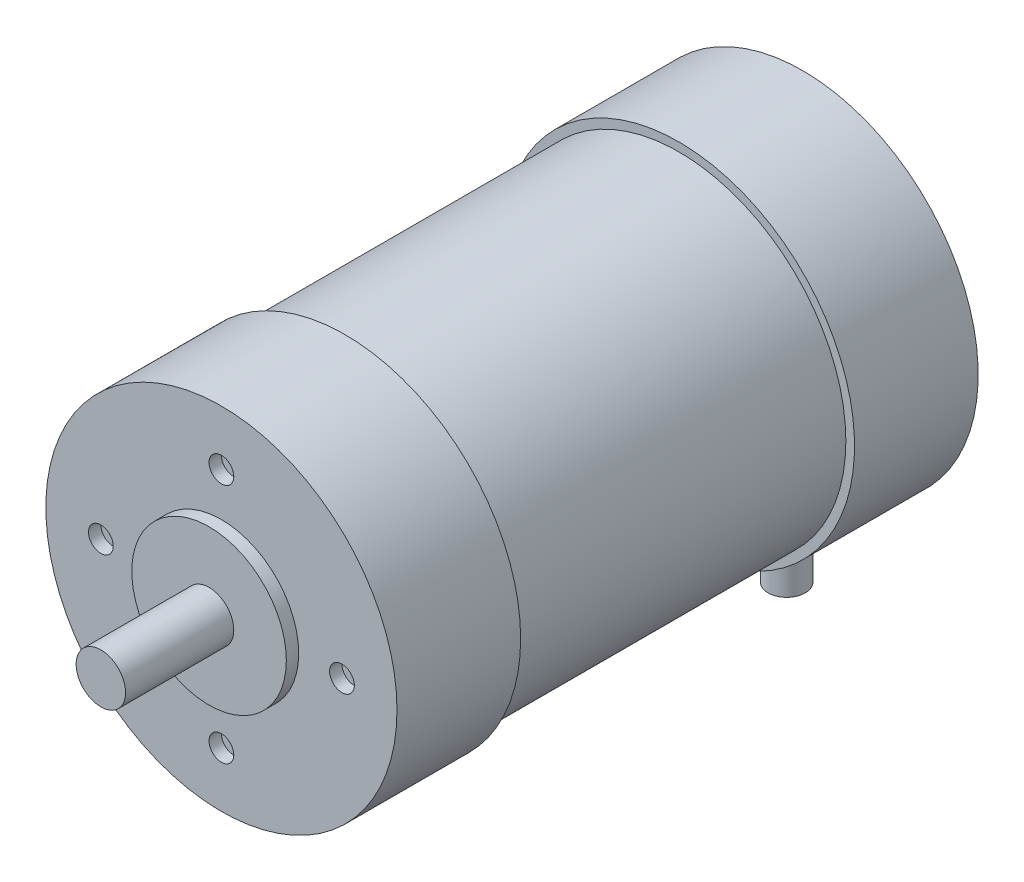
ISO-10303-21;
HEADER;
FILE_DESCRIPTION(('STEP AP214'),'2;1');
FILE_NAME('part.step','',(''),(''),'','','');
FILE_SCHEMA(('AUTOMOTIVE_DESIGN { 1 0 10303 214 1 1 1 1 }'));
ENDSEC;
DATA;
#1=APPLICATION_CONTEXT('core data for automotive mechanical design processes');
#2=APPLICATION_PROTOCOL_DEFINITION('international standard','automotive_design',2000,#1);
#3=PRODUCT_CONTEXT('',#1,'mechanical');
#4=PRODUCT('Part','Part','',(#3));
#5=PRODUCT_RELATED_PRODUCT_CATEGORY('part','',(#4));
#6=PRODUCT_DEFINITION_FORMATION('','',#4);
#7=PRODUCT_DEFINITION_CONTEXT('part definition',#1,'design');
#8=PRODUCT_DEFINITION('design','',#6,#7);
#9=PRODUCT_DEFINITION_SHAPE('','',#8);
#10=(LENGTH_UNIT() NAMED_UNIT(*) SI_UNIT(.MILLI.,.METRE.));
#11=(NAMED_UNIT(*) PLANE_ANGLE_UNIT() SI_UNIT($,.RADIAN.));
#12=(NAMED_UNIT(*) SI_UNIT($,.STERADIAN.) SOLID_ANGLE_UNIT());
#13=UNCERTAINTY_MEASURE_WITH_UNIT(LENGTH_MEASURE(1.E-05),#10,'distance_accuracy_value','');
#14=(GEOMETRIC_REPRESENTATION_CONTEXT(3) GLOBAL_UNCERTAINTY_ASSIGNED_CONTEXT((#13)) GLOBAL_UNIT_ASSIGNED_CONTEXT((#10,
#11,#12)) REPRESENTATION_CONTEXT('',''));
#15=CARTESIAN_POINT('',(0.,0.,0.));
#16=DIRECTION('',(0.,0.,1.));
#17=DIRECTION('',(1.,0.,0.));
#18=AXIS2_PLACEMENT_3D('',#15,#16,#17);
#19=CARTESIAN_POINT('',(0.,0.,0.));
#20=DIRECTION('',(0.,0.,1.));
#21=DIRECTION('',(1.,0.,0.));
#22=AXIS2_PLACEMENT_3D('',#19,#20,#21);
#23=PLANE('',#22);
#24=CARTESIAN_POINT('',(0.,-19.5,0.));
#25=DIRECTION('',(0.,0.,1.));
#26=DIRECTION('',(1.,0.,0.));
#27=AXIS2_PLACEMENT_3D('',#24,#25,#26);
#28=CIRCLE('',#27,2.);
#29=CARTESIAN_POINT('',(2.,-19.5,0.));
#30=VERTEX_POINT('',#29);
#31=EDGE_CURVE('E161',#30,#30,#28,.T.);
#32=ORIENTED_EDGE('',*,*,#31,.F.);
#33=EDGE_LOOP('',(#32));
#34=FACE_BOUND('',#33,.T.);
#35=CARTESIAN_POINT('',(-19.5,0.,0.));
#36=DIRECTION('',(0.,0.,1.));
#37=DIRECTION('',(1.,0.,0.));
#38=AXIS2_PLACEMENT_3D('',#35,#36,#37);
#39=CIRCLE('',#38,2.);
#40=CARTESIAN_POINT('',(-17.5,0.,0.));
#41=VERTEX_POINT('',#40);
#42=EDGE_CURVE('E155',#41,#41,#39,.T.);
#43=ORIENTED_EDGE('',*,*,#42,.F.);
#44=EDGE_LOOP('',(#43));
#45=FACE_BOUND('',#44,.T.);
#46=CARTESIAN_POINT('',(19.5,0.,0.));
#47=DIRECTION('',(0.,0.,1.));
#48=DIRECTION('',(1.,0.,0.));
#49=AXIS2_PLACEMENT_3D('',#46,#47,#48);
#50=CIRCLE('',#49,2.);
#51=CARTESIAN_POINT('',(21.5,0.,0.));
#52=VERTEX_POINT('',#51);
#53=EDGE_CURVE('E149',#52,#52,#50,.T.);
#54=ORIENTED_EDGE('',*,*,#53,.F.);
#55=EDGE_LOOP('',(#54));
#56=FACE_BOUND('',#55,.T.);
#57=CARTESIAN_POINT('',(0.,19.5,0.));
#58=DIRECTION('',(0.,0.,1.));
#59=DIRECTION('',(1.,0.,0.));
#60=AXIS2_PLACEMENT_3D('',#57,#58,#59);
#61=CIRCLE('',#60,2.);
#62=CARTESIAN_POINT('',(2.,19.5,0.));
#63=VERTEX_POINT('',#62);
#64=EDGE_CURVE('E143',#63,#63,#61,.T.);
#65=ORIENTED_EDGE('',*,*,#64,.F.);
#66=EDGE_LOOP('',(#65));
#67=FACE_BOUND('',#66,.T.);
#68=CARTESIAN_POINT('',(0.,0.,0.));
#69=DIRECTION('',(0.,0.,1.));
#70=DIRECTION('',(1.,0.,0.));
#71=AXIS2_PLACEMENT_3D('',#68,#69,#70);
#72=CIRCLE('',#71,28.4);
#73=CARTESIAN_POINT('',(28.4,0.,0.));
#74=VERTEX_POINT('',#73);
#75=EDGE_CURVE('E59',#74,#74,#72,.T.);
#76=ORIENTED_EDGE('',*,*,#75,.T.);
#77=EDGE_LOOP('',(#76));
#78=FACE_BOUND('',#77,.T.);
#79=CARTESIAN_POINT('',(0.,0.,0.));
#80=DIRECTION('',(0.,0.,1.));
#81=DIRECTION('',(1.,0.,0.));
#82=AXIS2_PLACEMENT_3D('',#79,#80,#81);
#83=CIRCLE('',#82,12.5);
#84=CARTESIAN_POINT('',(12.5,0.,0.));
#85=VERTEX_POINT('',#84);
#86=EDGE_CURVE('E134',#85,#85,#83,.T.);
#87=ORIENTED_EDGE('',*,*,#86,.F.);
#88=EDGE_LOOP('',(#87));
#89=FACE_BOUND('',#88,.T.);
#90=ADVANCED_FACE('F39',(#34,#45,#56,#67,#78,#89),#23,.T.);
#91=CARTESIAN_POINT('',(0.,0.,-94.));
#92=DIRECTION('',(0.,0.,1.));
#93=DIRECTION('',(1.,0.,0.));
#94=AXIS2_PLACEMENT_3D('',#91,#92,#93);
#95=CYLINDRICAL_SURFACE('',#94,27.);
#96=CARTESIAN_POINT('',(0.,0.,-20.));
#97=DIRECTION('',(0.,0.,1.));
#98=DIRECTION('',(1.,0.,0.));
#99=AXIS2_PLACEMENT_3D('',#96,#97,#98);
#100=CIRCLE('',#99,27.);
#101=CARTESIAN_POINT('',(27.,0.,-20.));
#102=VERTEX_POINT('',#101);
#103=EDGE_CURVE('E108',#102,#102,#100,.T.);
#104=ORIENTED_EDGE('',*,*,#103,.F.);
#105=EDGE_LOOP('',(#104));
#106=FACE_BOUND('',#105,.T.);
#107=CARTESIAN_POINT('',(0.,0.,-74.));
#108=DIRECTION('',(0.,0.,-1.));
#109=DIRECTION('',(-1.,0.,0.));
#110=AXIS2_PLACEMENT_3D('',#107,#108,#109);
#111=CIRCLE('',#110,27.);
#112=CARTESIAN_POINT('',(-27.,0.,-74.));
#113=VERTEX_POINT('',#112);
#114=EDGE_CURVE('E121',#113,#113,#111,.T.);
#115=ORIENTED_EDGE('',*,*,#114,.F.);
#116=EDGE_LOOP('',(#115));
#117=FACE_BOUND('',#116,.T.);
#118=ADVANCED_FACE('F41',(#106,#117),#95,.T.);
#119=CARTESIAN_POINT('',(0.,0.,-20.));
#120=DIRECTION('',(0.,0.,1.));
#121=DIRECTION('',(1.,0.,0.));
#122=AXIS2_PLACEMENT_3D('',#119,#120,#121);
#123=CYLINDRICAL_SURFACE('',#122,28.4);
#124=CARTESIAN_POINT('',(0.,0.,-20.));
#125=DIRECTION('',(0.,0.,1.));
#126=DIRECTION('',(1.,0.,0.));
#127=AXIS2_PLACEMENT_3D('',#124,#125,#126);
#128=CIRCLE('',#127,28.4);
#129=CARTESIAN_POINT('',(28.4,0.,-20.));
#130=VERTEX_POINT('',#129);
#131=EDGE_CURVE('E55',#130,#130,#128,.T.);
#132=ORIENTED_EDGE('',*,*,#131,.T.);
#133=EDGE_LOOP('',(#132));
#134=FACE_BOUND('',#133,.T.);
#135=ORIENTED_EDGE('',*,*,#75,.F.);
#136=EDGE_LOOP('',(#135));
#137=FACE_BOUND('',#136,.T.);
#138=ADVANCED_FACE('F94',(#134,#137),#123,.T.);
#139=CARTESIAN_POINT('',(0.,0.,-20.));
#140=DIRECTION('',(0.,0.,1.));
#141=DIRECTION('',(1.,0.,0.));
#142=AXIS2_PLACEMENT_3D('',#139,#140,#141);
#143=PLANE('',#142);
#144=ORIENTED_EDGE('',*,*,#103,.T.);
#145=EDGE_LOOP('',(#144));
#146=FACE_BOUND('',#145,.T.);
#147=ORIENTED_EDGE('',*,*,#131,.F.);
#148=EDGE_LOOP('',(#147));
#149=FACE_BOUND('',#148,.T.);
#150=ADVANCED_FACE('F85',(#146,#149),#143,.F.);
#151=CARTESIAN_POINT('',(0.,0.,-74.));
#152=DIRECTION('',(0.,0.,-1.));
#153=DIRECTION('',(-1.,0.,0.));
#154=AXIS2_PLACEMENT_3D('',#151,#152,#153);
#155=CYLINDRICAL_SURFACE('',#154,28.4);
#156=CARTESIAN_POINT('',(7.,-27.5238078760916,-81.4314864277551));
#157=CARTESIAN_POINT('',(6.8309176236314,-27.5668078110942,-81.4314925981187));
#158=CARTESIAN_POINT('',(6.66134154886599,-27.6082618431189,-81.4458194305876));
#159=CARTESIAN_POINT('',(6.32601267751149,-27.6870239441381,-81.5032250705098));
#160=CARTESIAN_POINT('',(6.16026303629806,-27.7243286819469,-81.5463267877426));
#161=CARTESIAN_POINT('',(5.83746348517817,-27.7940877070157,-81.6605961285709));
#162=CARTESIAN_POINT('',(5.68042052847133,-27.826538151756,-81.7317858253711));
#163=CARTESIAN_POINT('',(5.38013287970048,-27.8861548211975,-81.9005413972071));
#164=CARTESIAN_POINT('',(5.23688485707698,-27.9133223230008,-81.998100883929));
#165=CARTESIAN_POINT('',(4.97150419152741,-27.9617955644842,-82.2147430981071));
#166=CARTESIAN_POINT('',(4.84900271029016,-27.9832088621463,-82.3333499869032));
#167=CARTESIAN_POINT('',(4.62553448717353,-28.0210154868692,-82.5900560873981));
#168=CARTESIAN_POINT('',(4.52456643779123,-28.037409118749,-82.7281541147547));
#169=CARTESIAN_POINT('',(4.34885360966717,-28.0651970397568,-83.0174182520992));
#170=CARTESIAN_POINT('',(4.27370195256536,-28.076669682665,-83.1683298445736));
#171=CARTESIAN_POINT('',(4.14964710992014,-28.0952734082415,-83.4808308415308));
#172=CARTESIAN_POINT('',(4.10074279883632,-28.1024046770786,-83.6424197878127));
#173=CARTESIAN_POINT('',(4.03090748026973,-28.1125067221829,-83.970563989551));
#174=CARTESIAN_POINT('',(4.00979812910643,-28.1155040295703,-84.1370805025952));
#175=CARTESIAN_POINT('',(3.99560459901099,-28.1175247631607,-84.4713269428981));
#176=CARTESIAN_POINT('',(4.0025200115661,-28.1165482472895,-84.6390568524338));
#177=CARTESIAN_POINT('',(4.04413446518686,-28.1105924568381,-84.9706938462967));
#178=CARTESIAN_POINT('',(4.07879020016157,-28.1056194212737,-85.1346064797303));
#179=CARTESIAN_POINT('',(4.17478573872236,-28.0915200456278,-85.4542315239989));
#180=CARTESIAN_POINT('',(4.23612532350686,-28.0823937396022,-85.6099440020617));
#181=CARTESIAN_POINT('',(4.3836844421151,-28.0597373169236,-85.9088814575431));
#182=CARTESIAN_POINT('',(4.46992128679869,-28.046204135366,-86.0520976558681));
#183=CARTESIAN_POINT('',(4.66463550851809,-28.0144761333193,-86.3219238210659));
#184=CARTESIAN_POINT('',(4.77311285179797,-27.9962813199054,-86.4485338131425));
#185=CARTESIAN_POINT('',(5.00951835681816,-27.9549485735576,-86.6822020350893));
#186=CARTESIAN_POINT('',(5.13752660565853,-27.9317901211002,-86.7891755724932));
#187=CARTESIAN_POINT('',(5.40878568227077,-27.8805319694691,-86.9801239321495));
#188=CARTESIAN_POINT('',(5.55203710894841,-27.8524320761175,-87.0640978502813));
#189=CARTESIAN_POINT('',(5.85138442460587,-27.79109387322,-87.2079215330396));
#190=CARTESIAN_POINT('',(6.00761606922231,-27.7577968788405,-87.2674634344442));
#191=CARTESIAN_POINT('',(6.32684102575759,-27.6867805672414,-87.3597064019346));
#192=CARTESIAN_POINT('',(6.48983509578806,-27.6490607533246,-87.3924044500627));
#193=CARTESIAN_POINT('',(6.82198550580776,-27.5690109939854,-87.4309731203821));
#194=CARTESIAN_POINT('',(6.99119637371139,-27.5265930372759,-87.4361901894975));
#195=CARTESIAN_POINT('',(7.32739869272656,-27.4390128934422,-87.4183181277016));
#196=CARTESIAN_POINT('',(7.49438975761139,-27.3938502361871,-87.395224134419));
#197=CARTESIAN_POINT('',(7.82654466242949,-27.3008386497004,-87.3205391186306));
#198=CARTESIAN_POINT('',(7.99151740223535,-27.2529498157957,-87.2681466151414));
#199=CARTESIAN_POINT('',(8.31013553053945,-27.1574913850453,-87.1358003225909));
#200=CARTESIAN_POINT('',(8.46377917700904,-27.109921838313,-87.0558423055761));
#201=CARTESIAN_POINT('',(8.75753270985191,-27.0164711845738,-86.8690625008566));
#202=CARTESIAN_POINT('',(8.89743142902409,-26.970621618386,-86.7618919822588));
#203=CARTESIAN_POINT('',(9.15709709520029,-26.8835704168417,-86.5238400174977));
#204=CARTESIAN_POINT('',(9.27686561875858,-26.8423684175807,-86.3929604298481));
#205=CARTESIAN_POINT('',(9.48964324282202,-26.7678745476277,-86.114242347929));
#206=CARTESIAN_POINT('',(9.58322849665856,-26.7344157436038,-85.966889482332));
#207=CARTESIAN_POINT('',(9.74391099863547,-26.6762730645419,-85.6568051674973));
#208=CARTESIAN_POINT('',(9.81101934879267,-26.6515855120678,-85.4940801994792));
#209=CARTESIAN_POINT('',(9.91296787056867,-26.6138285584465,-85.1678003697596));
#210=CARTESIAN_POINT('',(9.94942416559528,-26.6001789663317,-85.0048174779155));
#211=CARTESIAN_POINT('',(9.99477458450298,-26.583173094088,-84.6745506464649));
#212=CARTESIAN_POINT('',(10.0036777915361,-26.5798134217876,-84.5072681426091));
#213=CARTESIAN_POINT('',(9.99379751596848,-26.5835290560295,-84.1814952147206));
#214=CARTESIAN_POINT('',(9.97628661472081,-26.5901247417619,-84.0229587787125));
#215=CARTESIAN_POINT('',(9.91658798637421,-26.6124460625017,-83.7112851740506));
#216=CARTESIAN_POINT('',(9.87440057622977,-26.6281715802419,-83.5581479360744));
#217=CARTESIAN_POINT('',(9.76677541357202,-26.6678339513716,-83.2610212020541));
#218=CARTESIAN_POINT('',(9.70128213118657,-26.6917904115213,-83.1170545306765));
#219=CARTESIAN_POINT('',(9.54925315149194,-26.7465562259906,-82.8421484906771));
#220=CARTESIAN_POINT('',(9.46271403190105,-26.7773666947768,-82.7112112456662));
#221=CARTESIAN_POINT('',(9.26662810400794,-26.8458723278537,-82.4594213541537));
#222=CARTESIAN_POINT('',(9.1561907640512,-26.8838231023947,-82.3393324289642));
#223=CARTESIAN_POINT('',(8.91814158751954,-26.9637256814701,-82.1191182157343));
#224=CARTESIAN_POINT('',(8.79052143836999,-27.0056794196493,-82.0190026488022));
#225=CARTESIAN_POINT('',(8.5138401418346,-27.0942201204714,-81.8358491740536));
#226=CARTESIAN_POINT('',(8.36397842239105,-27.1409349759011,-81.7540819455496));
#227=CARTESIAN_POINT('',(8.05282307196101,-27.234874248604,-81.6171634417797));
#228=CARTESIAN_POINT('',(7.8915388655095,-27.2820982191545,-81.5619905107128));
#229=CARTESIAN_POINT('',(7.60821536160174,-27.3622052085293,-81.4912482639338));
#230=CARTESIAN_POINT('',(7.48790710486876,-27.3953835563043,-81.4689028959094));
#231=CARTESIAN_POINT('',(7.24515257649744,-27.4605819572635,-81.4390197076212));
#232=CARTESIAN_POINT('',(7.1227062958447,-27.4926020055623,-81.4314819498049));
#233=CARTESIAN_POINT('',(7.,-27.5238078760916,-81.4314864277551));
#234=B_SPLINE_CURVE_WITH_KNOTS('',3,(#156,#157,#158,#159,#160,#161,#162,#163,#164,#165,#166,
#167,#168,#169,#170,#171,#172,#173,#174,#175,#176,#177,#178,#179,#180,#181,#182,#183,#184,#185,
#186,#187,#188,#189,#190,#191,#192,#193,#194,#195,#196,#197,#198,#199,#200,#201,#202,#203,#204,
#205,#206,#207,#208,#209,#210,#211,#212,#213,#214,#215,#216,#217,#218,#219,#220,#221,#222,#223,
#224,#225,#226,#227,#228,#229,#230,#231,#232,#233),.UNSPECIFIED.,.T.,.F.,(4,2,2,2,2,2,2,2,2,2,2,
2,2,2,2,2,2,2,2,2,2,2,2,2,2,2,2,2,2,2,2,2,2,2,2,2,2,2,4),(0.,0.52295081158189,1.04631847969134,
1.57009826307432,2.09375126974448,2.60680055899042,3.11981868717665,3.62433428746094,
4.12882825134535,4.6300691440705,5.1313027303093,5.63175535114956,6.13220386846783,
6.63300118497431,7.13379774139205,7.63670594239192,8.13963390999917,8.64871776995098,
9.1578588565309,9.67905540728369,10.2003414850967,10.7366390980404,11.2730190040617,
11.8166539860796,12.3602463718982,12.8907170926075,13.420965144913,13.9210994429459,
14.4210688491158,14.8977077451247,15.3743405191366,15.8521166337961,16.3299704920502,
16.8302942526789,17.3308609318602,17.8594658557884,18.3876396052017,18.7671533532309,
19.1466687017632),.UNSPECIFIED.);
#235=CARTESIAN_POINT('',(7.,-27.5238078760916,-81.4314864277551));
#236=VERTEX_POINT('',#235);
#237=EDGE_CURVE('E10',#236,#236,#234,.T.);
#238=ORIENTED_EDGE('',*,*,#237,.F.);
#239=EDGE_LOOP('',(#238));
#240=FACE_BOUND('',#239,.T.);
#241=CARTESIAN_POINT('',(-7.,-27.5238078760916,-81.4314864277551));
#242=CARTESIAN_POINT('',(-7.17497004166131,-27.47930594361,-81.4314938160888));
#243=CARTESIAN_POINT('',(-7.34964395868325,-27.4330889116566,-81.4468397552596));
#244=CARTESIAN_POINT('',(-7.69334322337776,-27.338697045564,-81.5074802994634));
#245=CARTESIAN_POINT('',(-7.86236014337892,-27.2905195083477,-81.5528176657875));
#246=CARTESIAN_POINT('',(-8.18983317558535,-27.1940387597737,-81.6720258350343));
#247=CARTESIAN_POINT('',(-8.34829743875431,-27.1457356760723,-81.7458743088361));
#248=CARTESIAN_POINT('',(-8.6504048551798,-27.0509812015139,-81.9201971090237));
#249=CARTESIAN_POINT('',(-8.79405170875643,-27.0045293501394,-82.0206647653841));
#250=CARTESIAN_POINT('',(-9.0624195732316,-26.9156564188223,-82.245827996543));
#251=CARTESIAN_POINT('',(-9.18713931762193,-26.8732356086879,-82.37052519139));
#252=CARTESIAN_POINT('',(-9.41359490461798,-26.7947500662591,-82.6410525112974));
#253=CARTESIAN_POINT('',(-9.51533464351279,-26.7586842566946,-82.7868790469583));
#254=CARTESIAN_POINT('',(-9.68858213912015,-26.6964332789671,-83.0895742542312));
#255=CARTESIAN_POINT('',(-9.76112237822759,-26.6699150291024,-83.2457822214787));
#256=CARTESIAN_POINT('',(-9.87864383969205,-26.6266100263304,-83.5694999743247));
#257=CARTESIAN_POINT('',(-9.92363745800604,-26.6098188964104,-83.7370046386902));
#258=CARTESIAN_POINT('',(-9.98233792798421,-26.5878516117253,-84.0678766942694));
#259=CARTESIAN_POINT('',(-9.99773667184892,-26.5820476607293,-84.2309035372935));
#260=CARTESIAN_POINT('',(-10.0017976945924,-26.5805202351137,-84.5573204578859));
#261=CARTESIAN_POINT('',(-9.99046563703069,-26.5847946251565,-84.7207104511841));
#262=CARTESIAN_POINT('',(-9.94230696511288,-26.6028409557983,-85.0379373238558));
#263=CARTESIAN_POINT('',(-9.90627708993116,-26.6163160349627,-85.1919134259339));
#264=CARTESIAN_POINT('',(-9.8109087910136,-26.6516159784208,-85.4914400501774));
#265=CARTESIAN_POINT('',(-9.75156851297081,-26.6734415069764,-85.6369899009903));
#266=CARTESIAN_POINT('',(-9.61003851144285,-26.7247623479693,-85.9191562011338));
#267=CARTESIAN_POINT('',(-9.52737376510511,-26.7544161820919,-86.0555048688941));
#268=CARTESIAN_POINT('',(-9.34237301906553,-26.8195761677617,-86.3125451992126));
#269=CARTESIAN_POINT('',(-9.24003220141929,-26.8550837523725,-86.4332330148573));
#270=CARTESIAN_POINT('',(-9.01236010556556,-26.9323702977787,-86.6626152798402));
#271=CARTESIAN_POINT('',(-8.88607118354313,-26.9743873273323,-86.7702790731388));
#272=CARTESIAN_POINT('',(-8.61815324960057,-27.0611762118056,-86.9630542547518));
#273=CARTESIAN_POINT('',(-8.4765201630819,-27.1059487970851,-87.0481596319634));
#274=CARTESIAN_POINT('',(-8.17430867000343,-27.1986546095214,-87.1974862601061));
#275=CARTESIAN_POINT('',(-8.01314479929409,-27.2466358629934,-87.2604957129632));
#276=CARTESIAN_POINT('',(-7.68216816446623,-27.3417983604668,-87.3579887580677));
#277=CARTESIAN_POINT('',(-7.51235446240305,-27.3889795169672,-87.3924692497565));
#278=CARTESIAN_POINT('',(-7.16640757741786,-27.4815403439945,-87.431987228374));
#279=CARTESIAN_POINT('',(-6.99022074841059,-27.5268883140486,-87.4366330523028));
#280=CARTESIAN_POINT('',(-6.63881102993907,-27.6137454580274,-87.4148607041723));
#281=CARTESIAN_POINT('',(-6.46358804491298,-27.6552550192129,-87.3884456695696));
#282=CARTESIAN_POINT('',(-6.1229349503463,-27.7326448349457,-87.3056587391637));
#283=CARTESIAN_POINT('',(-5.95737932137803,-27.7686207186224,-87.2498937896053));
#284=CARTESIAN_POINT('',(-5.63758798564498,-27.8353065991168,-87.109970710359));
#285=CARTESIAN_POINT('',(-5.4833503956564,-27.8660174731282,-87.025817317365));
#286=CARTESIAN_POINT('',(-5.1955306692622,-27.9210913895255,-86.8341741445084));
#287=CARTESIAN_POINT('',(-5.06147625431005,-27.9456138569051,-86.7274391138382));
#288=CARTESIAN_POINT('',(-4.81306141242432,-27.9894691044483,-86.4922022554667));
#289=CARTESIAN_POINT('',(-4.69869873310299,-28.0088024782944,-86.3637029205584));
#290=CARTESIAN_POINT('',(-4.4954289037343,-28.042138814776,-86.0914284182525));
#291=CARTESIAN_POINT('',(-4.40605419785626,-28.0562415670084,-85.948014273897));
#292=CARTESIAN_POINT('',(-4.25251627931989,-28.0799246480935,-85.6479296120485));
#293=CARTESIAN_POINT('',(-4.18835171811268,-28.0895052188536,-85.4912598041765));
#294=CARTESIAN_POINT('',(-4.08766385705169,-28.1043339992544,-85.1706028301424));
#295=CARTESIAN_POINT('',(-4.0509027914568,-28.1096195119001,-85.0066919960929));
#296=CARTESIAN_POINT('',(-4.00521225501553,-28.116166479952,-84.6749576328061));
#297=CARTESIAN_POINT('',(-3.99628231360948,-28.1174280033945,-84.5071341697706));
#298=CARTESIAN_POINT('',(-4.00651068136101,-28.1159722521064,-84.172785934704));
#299=CARTESIAN_POINT('',(-4.02559866738789,-28.1132649389129,-84.0062589622529));
#300=CARTESIAN_POINT('',(-4.09115952100544,-28.1037986321125,-83.678806517368));
#301=CARTESIAN_POINT('',(-4.13763220558546,-28.0970396655826,-83.5178810075076));
#302=CARTESIAN_POINT('',(-4.25656619453294,-28.0792670233942,-83.2061695906257));
#303=CARTESIAN_POINT('',(-4.32903056777194,-28.0682528453056,-83.0553848834391));
#304=CARTESIAN_POINT('',(-4.49774525780997,-28.0417108739752,-82.7682209917161));
#305=CARTESIAN_POINT('',(-4.59399455645986,-28.0261832739322,-82.6318411909128));
#306=CARTESIAN_POINT('',(-4.8076551812933,-27.9903230622741,-82.3768904833594));
#307=CARTESIAN_POINT('',(-4.92512459521207,-27.9699772124669,-82.2583701403691));
#308=CARTESIAN_POINT('',(-5.17751108176518,-27.9243583893367,-82.0427443947944));
#309=CARTESIAN_POINT('',(-5.31243253303757,-27.8990841786997,-81.9456443830721));
#310=CARTESIAN_POINT('',(-5.59705800311291,-27.8433863260617,-81.7744932488464));
#311=CARTESIAN_POINT('',(-5.74689489815595,-27.8129142768208,-81.7006793169084));
#312=CARTESIAN_POINT('',(-6.0557026312005,-27.7473115302834,-81.5791562081822));
#313=CARTESIAN_POINT('',(-6.21466418324322,-27.7121855231972,-81.5314209944573));
#314=CARTESIAN_POINT('',(-6.47876353061158,-27.6513440710147,-81.4752390054127));
#315=CARTESIAN_POINT('',(-6.5825556118209,-27.6268247820528,-81.4588253092943));
#316=CARTESIAN_POINT('',(-6.79093366032467,-27.5763434665917,-81.4369468366714));
#317=CARTESIAN_POINT('',(-6.89551962441044,-27.5503814459209,-81.4314820159377));
#318=CARTESIAN_POINT('',(-7.,-27.5238078760916,-81.4314864277551));
#319=B_SPLINE_CURVE_WITH_KNOTS('',3,(#241,#242,#243,#244,#245,#246,#247,#248,#249,#250,#251,
#252,#253,#254,#255,#256,#257,#258,#259,#260,#261,#262,#263,#264,#265,#266,#267,#268,#269,#270,
#271,#272,#273,#274,#275,#276,#277,#278,#279,#280,#281,#282,#283,#284,#285,#286,#287,#288,#289,
#290,#291,#292,#293,#294,#295,#296,#297,#298,#299,#300,#301,#302,#303,#304,#305,#306,#307,#308,
#309,#310,#311,#312,#313,#314,#315,#316,#317,#318),.UNSPECIFIED.,.T.,.F.,(4,2,2,2,2,2,2,2,2,2,2,
2,2,2,2,2,2,2,2,2,2,2,2,2,2,2,2,2,2,2,2,2,2,2,2,2,2,2,4),(0.,0.541223563993474,1.08322046378803,
1.62479374467412,2.16623145051405,2.70770537071832,3.24908741430139,3.76915657374306,
4.28899153013934,4.77810427160992,5.26711339215626,5.74104690304556,6.2150181222587,
6.69944143696013,7.18398352049058,7.69528919731131,8.2067309842302,8.74295538384889,
9.27923805326953,9.82254677566697,10.3658006231754,10.8982376908382,11.4305859637431,
11.9473600094787,12.4640749060416,12.9703516982534,13.4766014048617,13.9784058226247,
14.4802017559946,14.9807403667038,15.4812756323749,15.9818700163427,16.4824429753334,
16.984407555101,17.4864983207084,17.9935495255042,18.5000935619789,18.8232772861028,
19.1464597046875),.UNSPECIFIED.);
#320=CARTESIAN_POINT('',(-7.,-27.5238078760916,-81.4314864277551));
#321=VERTEX_POINT('',#320);
#322=EDGE_CURVE('E51',#321,#321,#319,.T.);
#323=ORIENTED_EDGE('',*,*,#322,.F.);
#324=EDGE_LOOP('',(#323));
#325=FACE_BOUND('',#324,.T.);
#326=CARTESIAN_POINT('',(0.,0.,-74.));
#327=DIRECTION('',(0.,0.,-1.));
#328=DIRECTION('',(-1.,0.,0.));
#329=AXIS2_PLACEMENT_3D('',#326,#327,#328);
#330=CIRCLE('',#329,28.4);
#331=CARTESIAN_POINT('',(-28.4,0.,-74.));
#332=VERTEX_POINT('',#331);
#333=EDGE_CURVE('E114',#332,#332,#330,.T.);
#334=ORIENTED_EDGE('',*,*,#333,.T.);
#335=EDGE_LOOP('',(#334));
#336=FACE_BOUND('',#335,.T.);
#337=CARTESIAN_POINT('',(0.,0.,-94.));
#338=DIRECTION('',(0.,0.,-1.));
#339=DIRECTION('',(-1.,0.,0.));
#340=AXIS2_PLACEMENT_3D('',#337,#338,#339);
#341=CIRCLE('',#340,28.4);
#342=CARTESIAN_POINT('',(-28.4,0.,-94.));
#343=VERTEX_POINT('',#342);
#344=EDGE_CURVE('E117',#343,#343,#341,.T.);
#345=ORIENTED_EDGE('',*,*,#344,.F.);
#346=EDGE_LOOP('',(#345));
#347=FACE_BOUND('',#346,.T.);
#348=ADVANCED_FACE('F66',(#240,#325,#336,#347),#155,.T.);
#349=CARTESIAN_POINT('',(0.,0.,-74.));
#350=DIRECTION('',(0.,0.,-1.));
#351=DIRECTION('',(-1.,0.,0.));
#352=AXIS2_PLACEMENT_3D('',#349,#350,#351);
#353=PLANE('',#352);
#354=ORIENTED_EDGE('',*,*,#114,.T.);
#355=EDGE_LOOP('',(#354));
#356=FACE_BOUND('',#355,.T.);
#357=ORIENTED_EDGE('',*,*,#333,.F.);
#358=EDGE_LOOP('',(#357));
#359=FACE_BOUND('',#358,.T.);
#360=ADVANCED_FACE('F76',(#356,#359),#353,.F.);
#361=CARTESIAN_POINT('',(0.,0.,-94.));
#362=DIRECTION('',(0.,0.,1.));
#363=DIRECTION('',(1.,0.,0.));
#364=AXIS2_PLACEMENT_3D('',#361,#362,#363);
#365=PLANE('',#364);
#366=ORIENTED_EDGE('',*,*,#344,.T.);
#367=EDGE_LOOP('',(#366));
#368=FACE_BOUND('',#367,.T.);
#369=ADVANCED_FACE('F75',(#368),#365,.F.);
#370=CARTESIAN_POINT('',(-7.,-35.,-84.4314864277551));
#371=DIRECTION('',(0.,1.,0.));
#372=DIRECTION('',(0.,0.,1.));
#373=AXIS2_PLACEMENT_3D('',#370,#371,#372);
#374=CYLINDRICAL_SURFACE('',#373,3.);
#375=ORIENTED_EDGE('',*,*,#322,.T.);
#376=EDGE_LOOP('',(#375));
#377=FACE_BOUND('',#376,.T.);
#378=CARTESIAN_POINT('',(-7.,-35.,-84.4314864277551));
#379=DIRECTION('',(0.,1.,0.));
#380=DIRECTION('',(0.,0.,1.));
#381=AXIS2_PLACEMENT_3D('',#378,#379,#380);
#382=CIRCLE('',#381,3.);
#383=CARTESIAN_POINT('',(-7.,-35.,-81.4314864277551));
#384=VERTEX_POINT('',#383);
#385=EDGE_CURVE('E124',#384,#384,#382,.T.);
#386=ORIENTED_EDGE('',*,*,#385,.T.);
#387=EDGE_LOOP('',(#386));
#388=FACE_BOUND('',#387,.T.);
#389=ADVANCED_FACE('F70',(#377,#388),#374,.T.);
#390=CARTESIAN_POINT('',(0.,-35.,0.));
#391=DIRECTION('',(0.,1.,0.));
#392=DIRECTION('',(0.,0.,1.));
#393=AXIS2_PLACEMENT_3D('',#390,#391,#392);
#394=PLANE('',#393);
#395=ORIENTED_EDGE('',*,*,#385,.F.);
#396=EDGE_LOOP('',(#395));
#397=FACE_BOUND('',#396,.T.);
#398=ADVANCED_FACE('F74',(#397),#394,.F.);
#399=CARTESIAN_POINT('',(7.,-35.,-84.4314864277551));
#400=DIRECTION('',(0.,1.,0.));
#401=DIRECTION('',(0.,0.,1.));
#402=AXIS2_PLACEMENT_3D('',#399,#400,#401);
#403=CYLINDRICAL_SURFACE('',#402,3.);
#404=ORIENTED_EDGE('',*,*,#237,.T.);
#405=EDGE_LOOP('',(#404));
#406=FACE_BOUND('',#405,.T.);
#407=CARTESIAN_POINT('',(7.,-35.,-84.4314864277551));
#408=DIRECTION('',(0.,1.,0.));
#409=DIRECTION('',(0.,0.,1.));
#410=AXIS2_PLACEMENT_3D('',#407,#408,#409);
#411=CIRCLE('',#410,3.);
#412=CARTESIAN_POINT('',(7.,-35.,-81.4314864277551));
#413=VERTEX_POINT('',#412);
#414=EDGE_CURVE('E127',#413,#413,#411,.T.);
#415=ORIENTED_EDGE('',*,*,#414,.T.);
#416=EDGE_LOOP('',(#415));
#417=FACE_BOUND('',#416,.T.);
#418=ADVANCED_FACE('F220',(#406,#417),#403,.T.);
#419=CARTESIAN_POINT('',(0.,-35.,0.));
#420=DIRECTION('',(0.,1.,0.));
#421=DIRECTION('',(0.,0.,1.));
#422=AXIS2_PLACEMENT_3D('',#419,#420,#421);
#423=PLANE('',#422);
#424=ORIENTED_EDGE('',*,*,#414,.F.);
#425=EDGE_LOOP('',(#424));
#426=FACE_BOUND('',#425,.T.);
#427=ADVANCED_FACE('F207',(#426),#423,.F.);
#428=CARTESIAN_POINT('',(0.,0.,2.));
#429=DIRECTION('',(0.,0.,1.));
#430=DIRECTION('',(1.,0.,0.));
#431=AXIS2_PLACEMENT_3D('',#428,#429,#430);
#432=PLANE('',#431);
#433=CARTESIAN_POINT('',(0.,0.,2.));
#434=DIRECTION('',(0.,0.,1.));
#435=DIRECTION('',(1.,0.,0.));
#436=AXIS2_PLACEMENT_3D('',#433,#434,#435);
#437=CIRCLE('',#436,12.5);
#438=CARTESIAN_POINT('',(12.5,0.,2.));
#439=VERTEX_POINT('',#438);
#440=EDGE_CURVE('E133',#439,#439,#437,.T.);
#441=ORIENTED_EDGE('',*,*,#440,.T.);
#442=EDGE_LOOP('',(#441));
#443=FACE_BOUND('',#442,.T.);
#444=CARTESIAN_POINT('',(0.,0.,2.));
#445=DIRECTION('',(0.,0.,1.));
#446=DIRECTION('',(1.,0.,0.));
#447=AXIS2_PLACEMENT_3D('',#444,#445,#446);
#448=CIRCLE('',#447,4.);
#449=CARTESIAN_POINT('',(4.,0.,2.));
#450=VERTEX_POINT('',#449);
#451=EDGE_CURVE('E137',#450,#450,#448,.T.);
#452=ORIENTED_EDGE('',*,*,#451,.F.);
#453=EDGE_LOOP('',(#452));
#454=FACE_BOUND('',#453,.T.);
#455=ADVANCED_FACE('F203',(#443,#454),#432,.T.);
#456=CARTESIAN_POINT('',(0.,0.,2.));
#457=DIRECTION('',(0.,0.,-1.));
#458=DIRECTION('',(-1.,0.,0.));
#459=AXIS2_PLACEMENT_3D('',#456,#457,#458);
#460=CYLINDRICAL_SURFACE('',#459,12.5);
#461=ORIENTED_EDGE('',*,*,#440,.F.);
#462=EDGE_LOOP('',(#461));
#463=FACE_BOUND('',#462,.T.);
#464=ORIENTED_EDGE('',*,*,#86,.T.);
#465=EDGE_LOOP('',(#464));
#466=FACE_BOUND('',#465,.T.);
#467=ADVANCED_FACE('F206',(#463,#466),#460,.T.);
#468=CARTESIAN_POINT('',(0.,0.,19.5));
#469=DIRECTION('',(0.,0.,1.));
#470=DIRECTION('',(1.,0.,0.));
#471=AXIS2_PLACEMENT_3D('',#468,#469,#470);
#472=PLANE('',#471);
#473=CARTESIAN_POINT('',(0.,0.,19.5));
#474=DIRECTION('',(0.,0.,1.));
#475=DIRECTION('',(1.,0.,0.));
#476=AXIS2_PLACEMENT_3D('',#473,#474,#475);
#477=CIRCLE('',#476,4.);
#478=CARTESIAN_POINT('',(4.,0.,19.5));
#479=VERTEX_POINT('',#478);
#480=EDGE_CURVE('E130',#479,#479,#477,.T.);
#481=ORIENTED_EDGE('',*,*,#480,.T.);
#482=EDGE_LOOP('',(#481));
#483=FACE_BOUND('',#482,.T.);
#484=ADVANCED_FACE('F211',(#483),#472,.T.);
#485=CARTESIAN_POINT('',(0.,0.,19.5));
#486=DIRECTION('',(0.,0.,-1.));
#487=DIRECTION('',(-1.,0.,0.));
#488=AXIS2_PLACEMENT_3D('',#485,#486,#487);
#489=CYLINDRICAL_SURFACE('',#488,4.);
#490=ORIENTED_EDGE('',*,*,#451,.T.);
#491=EDGE_LOOP('',(#490));
#492=FACE_BOUND('',#491,.T.);
#493=ORIENTED_EDGE('',*,*,#480,.F.);
#494=EDGE_LOOP('',(#493));
#495=FACE_BOUND('',#494,.T.);
#496=ADVANCED_FACE('F201',(#492,#495),#489,.T.);
#497=CARTESIAN_POINT('',(0.,19.5,-2.));
#498=DIRECTION('',(0.,0.,1.));
#499=DIRECTION('',(1.,0.,0.));
#500=AXIS2_PLACEMENT_3D('',#497,#498,#499);
#501=CYLINDRICAL_SURFACE('',#500,2.);
#502=CARTESIAN_POINT('',(0.,19.5,-2.));
#503=DIRECTION('',(0.,0.,1.));
#504=DIRECTION('',(1.,0.,0.));
#505=AXIS2_PLACEMENT_3D('',#502,#503,#504);
#506=CIRCLE('',#505,2.);
#507=CARTESIAN_POINT('',(2.,19.5,-2.));
#508=VERTEX_POINT('',#507);
#509=EDGE_CURVE('E146',#508,#508,#506,.T.);
#510=ORIENTED_EDGE('',*,*,#509,.F.);
#511=EDGE_LOOP('',(#510));
#512=FACE_BOUND('',#511,.T.);
#513=ORIENTED_EDGE('',*,*,#64,.T.);
#514=EDGE_LOOP('',(#513));
#515=FACE_BOUND('',#514,.T.);
#516=ADVANCED_FACE('F197',(#512,#515),#501,.F.);
#517=CARTESIAN_POINT('',(0.,0.,-2.));
#518=DIRECTION('',(0.,0.,1.));
#519=DIRECTION('',(1.,0.,0.));
#520=AXIS2_PLACEMENT_3D('',#517,#518,#519);
#521=PLANE('',#520);
#522=ORIENTED_EDGE('',*,*,#509,.T.);
#523=EDGE_LOOP('',(#522));
#524=FACE_BOUND('',#523,.T.);
#525=ADVANCED_FACE('F193',(#524),#521,.T.);
#526=CARTESIAN_POINT('',(19.5,0.,-2.));
#527=DIRECTION('',(0.,0.,1.));
#528=DIRECTION('',(1.,0.,0.));
#529=AXIS2_PLACEMENT_3D('',#526,#527,#528);
#530=CYLINDRICAL_SURFACE('',#529,2.);
#531=CARTESIAN_POINT('',(19.5,0.,-2.));
#532=DIRECTION('',(0.,0.,1.));
#533=DIRECTION('',(1.,0.,0.));
#534=AXIS2_PLACEMENT_3D('',#531,#532,#533);
#535=CIRCLE('',#534,2.);
#536=CARTESIAN_POINT('',(21.5,0.,-2.));
#537=VERTEX_POINT('',#536);
#538=EDGE_CURVE('E152',#537,#537,#535,.T.);
#539=ORIENTED_EDGE('',*,*,#538,.F.);
#540=EDGE_LOOP('',(#539));
#541=FACE_BOUND('',#540,.T.);
#542=ORIENTED_EDGE('',*,*,#53,.T.);
#543=EDGE_LOOP('',(#542));
#544=FACE_BOUND('',#543,.T.);
#545=ADVANCED_FACE('F189',(#541,#544),#530,.F.);
#546=CARTESIAN_POINT('',(0.,0.,-2.));
#547=DIRECTION('',(0.,0.,1.));
#548=DIRECTION('',(1.,0.,0.));
#549=AXIS2_PLACEMENT_3D('',#546,#547,#548);
#550=PLANE('',#549);
#551=ORIENTED_EDGE('',*,*,#538,.T.);
#552=EDGE_LOOP('',(#551));
#553=FACE_BOUND('',#552,.T.);
#554=ADVANCED_FACE('F185',(#553),#550,.T.);
#555=CARTESIAN_POINT('',(-19.5,0.,-2.));
#556=DIRECTION('',(0.,0.,1.));
#557=DIRECTION('',(1.,0.,0.));
#558=AXIS2_PLACEMENT_3D('',#555,#556,#557);
#559=CYLINDRICAL_SURFACE('',#558,2.);
#560=CARTESIAN_POINT('',(-19.5,0.,-2.));
#561=DIRECTION('',(0.,0.,1.));
#562=DIRECTION('',(1.,0.,0.));
#563=AXIS2_PLACEMENT_3D('',#560,#561,#562);
#564=CIRCLE('',#563,2.);
#565=CARTESIAN_POINT('',(-17.5,0.,-2.));
#566=VERTEX_POINT('',#565);
#567=EDGE_CURVE('E158',#566,#566,#564,.T.);
#568=ORIENTED_EDGE('',*,*,#567,.F.);
#569=EDGE_LOOP('',(#568));
#570=FACE_BOUND('',#569,.T.);
#571=ORIENTED_EDGE('',*,*,#42,.T.);
#572=EDGE_LOOP('',(#571));
#573=FACE_BOUND('',#572,.T.);
#574=ADVANCED_FACE('F179',(#570,#573),#559,.F.);
#575=CARTESIAN_POINT('',(0.,0.,-2.));
#576=DIRECTION('',(0.,0.,1.));
#577=DIRECTION('',(1.,0.,0.));
#578=AXIS2_PLACEMENT_3D('',#575,#576,#577);
#579=PLANE('',#578);
#580=ORIENTED_EDGE('',*,*,#567,.T.);
#581=EDGE_LOOP('',(#580));
#582=FACE_BOUND('',#581,.T.);
#583=ADVANCED_FACE('F172',(#582),#579,.T.);
#584=CARTESIAN_POINT('',(0.,-19.5,-2.));
#585=DIRECTION('',(0.,0.,1.));
#586=DIRECTION('',(1.,0.,0.));
#587=AXIS2_PLACEMENT_3D('',#584,#585,#586);
#588=CYLINDRICAL_SURFACE('',#587,2.);
#589=CARTESIAN_POINT('',(0.,-19.5,-2.));
#590=DIRECTION('',(0.,0.,1.));
#591=DIRECTION('',(1.,0.,0.));
#592=AXIS2_PLACEMENT_3D('',#589,#590,#591);
#593=CIRCLE('',#592,2.);
#594=CARTESIAN_POINT('',(2.,-19.5,-2.));
#595=VERTEX_POINT('',#594);
#596=EDGE_CURVE('E142',#595,#595,#593,.T.);
#597=ORIENTED_EDGE('',*,*,#596,.F.);
#598=EDGE_LOOP('',(#597));
#599=FACE_BOUND('',#598,.T.);
#600=ORIENTED_EDGE('',*,*,#31,.T.);
#601=EDGE_LOOP('',(#600));
#602=FACE_BOUND('',#601,.T.);
#603=ADVANCED_FACE('F169',(#599,#602),#588,.F.);
#604=CARTESIAN_POINT('',(0.,0.,-2.));
#605=DIRECTION('',(0.,0.,1.));
#606=DIRECTION('',(1.,0.,0.));
#607=AXIS2_PLACEMENT_3D('',#604,#605,#606);
#608=PLANE('',#607);
#609=ORIENTED_EDGE('',*,*,#596,.T.);
#610=EDGE_LOOP('',(#609));
#611=FACE_BOUND('',#610,.T.);
#612=ADVANCED_FACE('F167',(#611),#608,.T.);
#613=CLOSED_SHELL('',(#90,#118,#138,#150,#348,#360,#369,#389,#398,#418,#427,#455,#467,#484,#496,
#516,#525,#545,#554,#574,#583,#603,#612));
#614=MANIFOLD_SOLID_BREP('B2',#613);
#615=ADVANCED_BREP_SHAPE_REPRESENTATION('',(#18,#614),#14);
#616=SHAPE_DEFINITION_REPRESENTATION(#9,#615);
ENDSEC;
END-ISO-10303-21;
